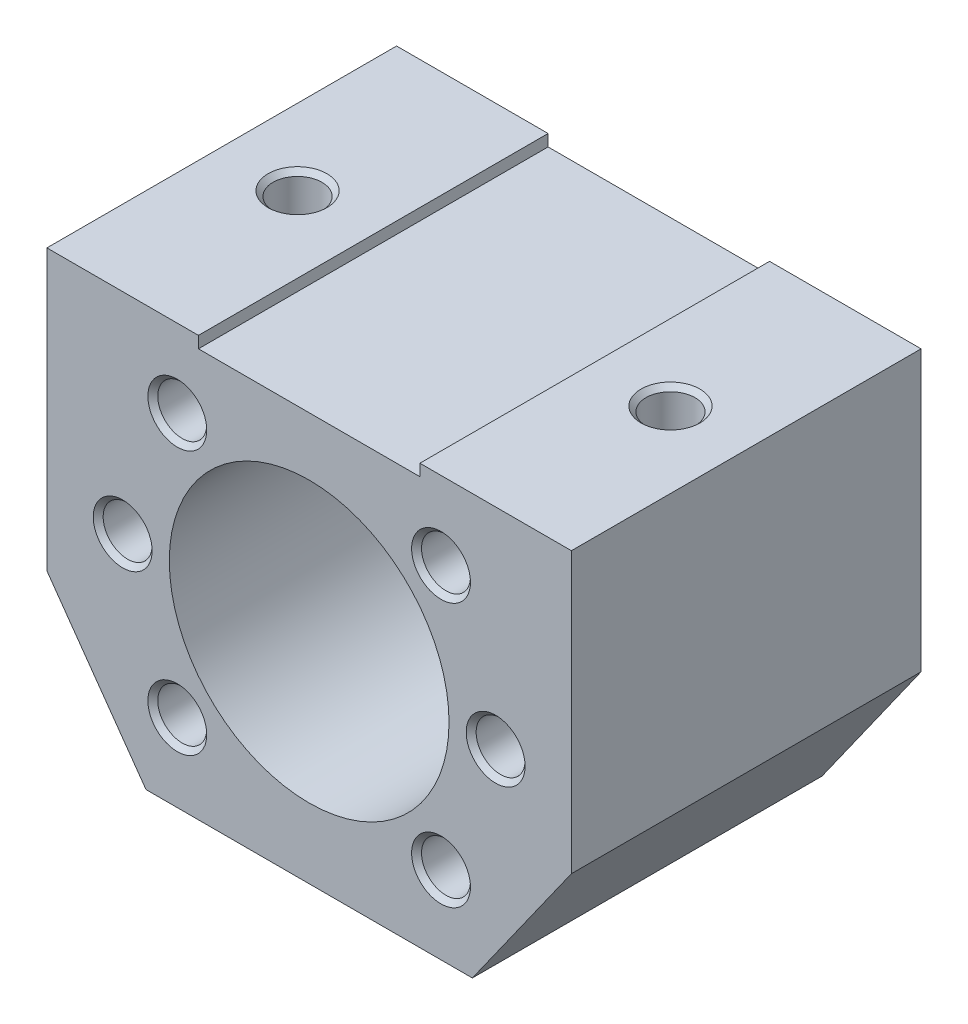
ISO-10303-21;
HEADER;
FILE_DESCRIPTION(('STEP AP214'),'2;1');
FILE_NAME('part.step','',(''),(''),'','','');
FILE_SCHEMA(('AUTOMOTIVE_DESIGN { 1 0 10303 214 1 1 1 1 }'));
ENDSEC;
DATA;
#1=APPLICATION_CONTEXT('core data for automotive mechanical design processes');
#2=APPLICATION_PROTOCOL_DEFINITION('international standard','automotive_design',2000,#1);
#3=PRODUCT_CONTEXT('',#1,'mechanical');
#4=PRODUCT('Part','Part','',(#3));
#5=PRODUCT_RELATED_PRODUCT_CATEGORY('part','',(#4));
#6=PRODUCT_DEFINITION_FORMATION('','',#4);
#7=PRODUCT_DEFINITION_CONTEXT('part definition',#1,'design');
#8=PRODUCT_DEFINITION('design','',#6,#7);
#9=PRODUCT_DEFINITION_SHAPE('','',#8);
#10=(LENGTH_UNIT() NAMED_UNIT(*) SI_UNIT(.MILLI.,.METRE.));
#11=(NAMED_UNIT(*) PLANE_ANGLE_UNIT() SI_UNIT($,.RADIAN.));
#12=(NAMED_UNIT(*) SI_UNIT($,.STERADIAN.) SOLID_ANGLE_UNIT());
#13=UNCERTAINTY_MEASURE_WITH_UNIT(LENGTH_MEASURE(1.E-05),#10,'distance_accuracy_value','');
#14=(GEOMETRIC_REPRESENTATION_CONTEXT(3) GLOBAL_UNCERTAINTY_ASSIGNED_CONTEXT((#13)) GLOBAL_UNIT_ASSIGNED_CONTEXT((#10,
#11,#12)) REPRESENTATION_CONTEXT('',''));
#15=CARTESIAN_POINT('',(0.,0.,0.));
#16=DIRECTION('',(0.,0.,1.));
#17=DIRECTION('',(1.,0.,0.));
#18=AXIS2_PLACEMENT_3D('',#15,#16,#17);
#19=CARTESIAN_POINT('',(-22.5,18.,-30.));
#20=DIRECTION('',(0.,1.,0.));
#21=DIRECTION('',(0.,0.,1.));
#22=AXIS2_PLACEMENT_3D('',#19,#20,#21);
#23=PLANE('',#22);
#24=CARTESIAN_POINT('',(-16.,18.,-15.));
#25=DIRECTION('',(0.,1.,0.));
#26=DIRECTION('',(0.,0.,1.));
#27=AXIS2_PLACEMENT_3D('',#24,#25,#26);
#28=CIRCLE('',#27,2.525);
#29=CARTESIAN_POINT('',(-16.,18.,-12.475));
#30=VERTEX_POINT('',#29);
#31=EDGE_CURVE('E382',#30,#30,#28,.T.);
#32=ORIENTED_EDGE('',*,*,#31,.F.);
#33=EDGE_LOOP('',(#32));
#34=FACE_BOUND('',#33,.T.);
#35=DIRECTION('',(0.,0.,1.));
#36=VECTOR('',#35,1.);
#37=CARTESIAN_POINT('',(-9.5,18.,-30.));
#38=LINE('',#37,#36);
#39=CARTESIAN_POINT('',(-9.5,18.,-30.));
#40=VERTEX_POINT('',#39);
#41=CARTESIAN_POINT('',(-9.5,18.,0.));
#42=VERTEX_POINT('',#41);
#43=EDGE_CURVE('E181',#40,#42,#38,.T.);
#44=ORIENTED_EDGE('',*,*,#43,.F.);
#45=DIRECTION('',(-1.,0.,0.));
#46=VECTOR('',#45,1.);
#47=CARTESIAN_POINT('',(0.,18.,-30.));
#48=LINE('',#47,#46);
#49=CARTESIAN_POINT('',(-22.5,18.,-30.));
#50=VERTEX_POINT('',#49);
#51=EDGE_CURVE('E70',#40,#50,#48,.T.);
#52=ORIENTED_EDGE('',*,*,#51,.T.);
#53=DIRECTION('',(0.,0.,1.));
#54=VECTOR('',#53,1.);
#55=CARTESIAN_POINT('',(-22.5,18.,-30.));
#56=LINE('',#55,#54);
#57=CARTESIAN_POINT('',(-22.5,18.,0.));
#58=VERTEX_POINT('',#57);
#59=EDGE_CURVE('E11',#50,#58,#56,.T.);
#60=ORIENTED_EDGE('',*,*,#59,.T.);
#61=DIRECTION('',(-1.,0.,0.));
#62=VECTOR('',#61,1.);
#63=CARTESIAN_POINT('',(-22.5,18.,0.));
#64=LINE('',#63,#62);
#65=EDGE_CURVE('E99',#42,#58,#64,.T.);
#66=ORIENTED_EDGE('',*,*,#65,.F.);
#67=EDGE_LOOP('',(#44,#52,#60,#66));
#68=FACE_BOUND('',#67,.T.);
#69=ADVANCED_FACE('F40',(#34,#68),#23,.T.);
#70=CARTESIAN_POINT('',(0.,0.,0.));
#71=DIRECTION('',(0.,0.,-1.));
#72=DIRECTION('',(-1.,0.,0.));
#73=AXIS2_PLACEMENT_3D('',#70,#71,#72);
#74=PLANE('',#73);
#75=CARTESIAN_POINT('',(16.,0.,0.));
#76=DIRECTION('',(0.,0.,1.));
#77=DIRECTION('',(1.,0.,0.));
#78=AXIS2_PLACEMENT_3D('',#75,#76,#77);
#79=CIRCLE('',#78,2.525);
#80=CARTESIAN_POINT('',(18.525,0.,0.));
#81=VERTEX_POINT('',#80);
#82=EDGE_CURVE('E339',#81,#81,#79,.T.);
#83=ORIENTED_EDGE('',*,*,#82,.F.);
#84=EDGE_LOOP('',(#83));
#85=FACE_BOUND('',#84,.T.);
#86=CARTESIAN_POINT('',(11.3137084989848,-11.3137084989847,0.));
#87=DIRECTION('',(0.,0.,1.));
#88=DIRECTION('',(1.,0.,0.));
#89=AXIS2_PLACEMENT_3D('',#86,#87,#88);
#90=CIRCLE('',#89,2.525);
#91=CARTESIAN_POINT('',(13.8387084989848,-11.3137084989847,0.));
#92=VERTEX_POINT('',#91);
#93=EDGE_CURVE('E330',#92,#92,#90,.T.);
#94=ORIENTED_EDGE('',*,*,#93,.F.);
#95=EDGE_LOOP('',(#94));
#96=FACE_BOUND('',#95,.T.);
#97=CARTESIAN_POINT('',(-11.3137084989847,-11.3137084989848,0.));
#98=DIRECTION('',(0.,0.,1.));
#99=DIRECTION('',(1.,0.,0.));
#100=AXIS2_PLACEMENT_3D('',#97,#98,#99);
#101=CIRCLE('',#100,2.525);
#102=CARTESIAN_POINT('',(-8.78870849898474,-11.3137084989848,0.));
#103=VERTEX_POINT('',#102);
#104=EDGE_CURVE('E321',#103,#103,#101,.T.);
#105=ORIENTED_EDGE('',*,*,#104,.F.);
#106=EDGE_LOOP('',(#105));
#107=FACE_BOUND('',#106,.T.);
#108=CARTESIAN_POINT('',(-16.,0.,0.));
#109=DIRECTION('',(0.,0.,1.));
#110=DIRECTION('',(1.,0.,0.));
#111=AXIS2_PLACEMENT_3D('',#108,#109,#110);
#112=CIRCLE('',#111,2.525);
#113=CARTESIAN_POINT('',(-13.475,0.,0.));
#114=VERTEX_POINT('',#113);
#115=EDGE_CURVE('E312',#114,#114,#112,.T.);
#116=ORIENTED_EDGE('',*,*,#115,.F.);
#117=EDGE_LOOP('',(#116));
#118=FACE_BOUND('',#117,.T.);
#119=CARTESIAN_POINT('',(0.,0.,0.));
#120=DIRECTION('',(0.,0.,1.));
#121=DIRECTION('',(1.,0.,0.));
#122=AXIS2_PLACEMENT_3D('',#119,#120,#121);
#123=CIRCLE('',#122,12.);
#124=CARTESIAN_POINT('',(12.,0.,0.));
#125=VERTEX_POINT('',#124);
#126=EDGE_CURVE('E301',#125,#125,#123,.T.);
#127=ORIENTED_EDGE('',*,*,#126,.F.);
#128=EDGE_LOOP('',(#127));
#129=FACE_BOUND('',#128,.T.);
#130=DIRECTION('',(1.,0.,0.));
#131=VECTOR('',#130,1.);
#132=CARTESIAN_POINT('',(-9.5,17.,0.));
#133=LINE('',#132,#131);
#134=CARTESIAN_POINT('',(-9.5,17.,0.));
#135=VERTEX_POINT('',#134);
#136=CARTESIAN_POINT('',(9.50000000000001,17.,0.));
#137=VERTEX_POINT('',#136);
#138=EDGE_CURVE('E373',#135,#137,#133,.T.);
#139=ORIENTED_EDGE('',*,*,#138,.F.);
#140=DIRECTION('',(0.,1.,0.));
#141=VECTOR('',#140,1.);
#142=CARTESIAN_POINT('',(-9.5,17.,0.));
#143=LINE('',#142,#141);
#144=EDGE_CURVE('E361',#135,#42,#143,.T.);
#145=ORIENTED_EDGE('',*,*,#144,.T.);
#146=ORIENTED_EDGE('',*,*,#65,.T.);
#147=DIRECTION('',(0.,-1.,0.));
#148=VECTOR('',#147,1.);
#149=CARTESIAN_POINT('',(-22.5,-6.,0.));
#150=LINE('',#149,#148);
#151=CARTESIAN_POINT('',(-22.5,-6.,0.));
#152=VERTEX_POINT('',#151);
#153=EDGE_CURVE('E154',#58,#152,#150,.T.);
#154=ORIENTED_EDGE('',*,*,#153,.T.);
#155=DIRECTION('',(0.578017340780339,-0.816024481101655,0.));
#156=VECTOR('',#155,1.);
#157=CARTESIAN_POINT('',(-14.,-18.,0.));
#158=LINE('',#157,#156);
#159=CARTESIAN_POINT('',(-14.,-18.,0.));
#160=VERTEX_POINT('',#159);
#161=EDGE_CURVE('E156',#152,#160,#158,.T.);
#162=ORIENTED_EDGE('',*,*,#161,.T.);
#163=DIRECTION('',(1.,0.,0.));
#164=VECTOR('',#163,1.);
#165=CARTESIAN_POINT('',(14.,-18.,0.));
#166=LINE('',#165,#164);
#167=CARTESIAN_POINT('',(14.,-18.,0.));
#168=VERTEX_POINT('',#167);
#169=EDGE_CURVE('E160',#160,#168,#166,.T.);
#170=ORIENTED_EDGE('',*,*,#169,.T.);
#171=DIRECTION('',(0.578017340780339,0.816024481101655,0.));
#172=VECTOR('',#171,1.);
#173=CARTESIAN_POINT('',(22.5,-6.,0.));
#174=LINE('',#173,#172);
#175=CARTESIAN_POINT('',(22.5,-6.,0.));
#176=VERTEX_POINT('',#175);
#177=EDGE_CURVE('E163',#168,#176,#174,.T.);
#178=ORIENTED_EDGE('',*,*,#177,.T.);
#179=DIRECTION('',(0.,1.,0.));
#180=VECTOR('',#179,1.);
#181=CARTESIAN_POINT('',(22.5,18.,0.));
#182=LINE('',#181,#180);
#183=CARTESIAN_POINT('',(22.5,18.,0.));
#184=VERTEX_POINT('',#183);
#185=EDGE_CURVE('E126',#176,#184,#182,.T.);
#186=ORIENTED_EDGE('',*,*,#185,.T.);
#187=CARTESIAN_POINT('',(9.50000000000001,18.,0.));
#188=VERTEX_POINT('',#187);
#189=EDGE_CURVE('E166',#184,#188,#64,.T.);
#190=ORIENTED_EDGE('',*,*,#189,.T.);
#191=DIRECTION('',(0.,1.,0.));
#192=VECTOR('',#191,1.);
#193=CARTESIAN_POINT('',(9.50000000000001,17.,0.));
#194=LINE('',#193,#192);
#195=EDGE_CURVE('E292',#137,#188,#194,.T.);
#196=ORIENTED_EDGE('',*,*,#195,.F.);
#197=EDGE_LOOP('',(#139,#145,#146,#154,#162,#170,#178,#186,#190,#196));
#198=FACE_BOUND('',#197,.T.);
#199=CARTESIAN_POINT('',(11.3137084989847,11.3137084989849,0.));
#200=DIRECTION('',(0.,0.,1.));
#201=DIRECTION('',(1.,0.,0.));
#202=AXIS2_PLACEMENT_3D('',#199,#200,#201);
#203=CIRCLE('',#202,2.525);
#204=CARTESIAN_POINT('',(13.8387084989847,11.3137084989849,0.));
#205=VERTEX_POINT('',#204);
#206=EDGE_CURVE('E348',#205,#205,#203,.T.);
#207=ORIENTED_EDGE('',*,*,#206,.F.);
#208=EDGE_LOOP('',(#207));
#209=FACE_BOUND('',#208,.T.);
#210=CARTESIAN_POINT('',(-11.3137084989849,11.3137084989846,0.));
#211=DIRECTION('',(0.,0.,1.));
#212=DIRECTION('',(1.,0.,0.));
#213=AXIS2_PLACEMENT_3D('',#210,#211,#212);
#214=CIRCLE('',#213,2.525);
#215=CARTESIAN_POINT('',(-8.7887084989849,11.3137084989846,0.));
#216=VERTEX_POINT('',#215);
#217=EDGE_CURVE('E357',#216,#216,#214,.T.);
#218=ORIENTED_EDGE('',*,*,#217,.F.);
#219=EDGE_LOOP('',(#218));
#220=FACE_BOUND('',#219,.T.);
#221=ADVANCED_FACE('F256',(#85,#96,#107,#118,#129,#198,#209,#220),#74,.F.);
#222=CARTESIAN_POINT('',(-22.5,-6.,-30.));
#223=DIRECTION('',(-1.,0.,0.));
#224=DIRECTION('',(0.,-1.,0.));
#225=AXIS2_PLACEMENT_3D('',#222,#223,#224);
#226=PLANE('',#225);
#227=ORIENTED_EDGE('',*,*,#153,.F.);
#228=ORIENTED_EDGE('',*,*,#59,.F.);
#229=DIRECTION('',(0.,-1.,0.));
#230=VECTOR('',#229,1.);
#231=CARTESIAN_POINT('',(-22.5,-6.,-30.));
#232=LINE('',#231,#230);
#233=CARTESIAN_POINT('',(-22.5,-6.,-30.));
#234=VERTEX_POINT('',#233);
#235=EDGE_CURVE('E168',#50,#234,#232,.T.);
#236=ORIENTED_EDGE('',*,*,#235,.T.);
#237=DIRECTION('',(0.,0.,1.));
#238=VECTOR('',#237,1.);
#239=CARTESIAN_POINT('',(-22.5,-6.,-30.));
#240=LINE('',#239,#238);
#241=EDGE_CURVE('E106',#234,#152,#240,.T.);
#242=ORIENTED_EDGE('',*,*,#241,.T.);
#243=EDGE_LOOP('',(#227,#228,#236,#242));
#244=FACE_BOUND('',#243,.T.);
#245=ADVANCED_FACE('F42',(#244),#226,.T.);
#246=CARTESIAN_POINT('',(16.,18.,-15.));
#247=DIRECTION('',(0.,1.,0.));
#248=DIRECTION('',(0.,0.,1.));
#249=AXIS2_PLACEMENT_3D('',#246,#247,#248);
#250=CIRCLE('',#249,2.525);
#251=CARTESIAN_POINT('',(16.,18.,-12.475));
#252=VERTEX_POINT('',#251);
#253=EDGE_CURVE('E277',#252,#252,#250,.T.);
#254=ORIENTED_EDGE('',*,*,#253,.F.);
#255=EDGE_LOOP('',(#254));
#256=FACE_BOUND('',#255,.T.);
#257=DIRECTION('',(0.,0.,-1.));
#258=VECTOR('',#257,1.);
#259=CARTESIAN_POINT('',(9.5,18.,-30.));
#260=LINE('',#259,#258);
#261=CARTESIAN_POINT('',(9.5,18.,-30.));
#262=VERTEX_POINT('',#261);
#263=EDGE_CURVE('E281',#188,#262,#260,.T.);
#264=ORIENTED_EDGE('',*,*,#263,.F.);
#265=ORIENTED_EDGE('',*,*,#189,.F.);
#266=DIRECTION('',(0.,0.,1.));
#267=VECTOR('',#266,1.);
#268=CARTESIAN_POINT('',(22.5,18.,-30.));
#269=LINE('',#268,#267);
#270=CARTESIAN_POINT('',(22.5,18.,-30.));
#271=VERTEX_POINT('',#270);
#272=EDGE_CURVE('E54',#271,#184,#269,.T.);
#273=ORIENTED_EDGE('',*,*,#272,.F.);
#274=EDGE_CURVE('E144',#271,#262,#48,.T.);
#275=ORIENTED_EDGE('',*,*,#274,.T.);
#276=EDGE_LOOP('',(#264,#265,#273,#275));
#277=FACE_BOUND('',#276,.T.);
#278=ADVANCED_FACE('F259',(#256,#277),#23,.T.);
#279=CARTESIAN_POINT('',(22.5,18.,-30.));
#280=DIRECTION('',(1.,0.,0.));
#281=DIRECTION('',(0.,1.,0.));
#282=AXIS2_PLACEMENT_3D('',#279,#280,#281);
#283=PLANE('',#282);
#284=ORIENTED_EDGE('',*,*,#185,.F.);
#285=DIRECTION('',(0.,0.,1.));
#286=VECTOR('',#285,1.);
#287=CARTESIAN_POINT('',(22.5,-6.,-30.));
#288=LINE('',#287,#286);
#289=CARTESIAN_POINT('',(22.5,-6.,-30.));
#290=VERTEX_POINT('',#289);
#291=EDGE_CURVE('E120',#290,#176,#288,.T.);
#292=ORIENTED_EDGE('',*,*,#291,.F.);
#293=DIRECTION('',(0.,1.,0.));
#294=VECTOR('',#293,1.);
#295=CARTESIAN_POINT('',(22.5,18.,-30.));
#296=LINE('',#295,#294);
#297=EDGE_CURVE('E124',#290,#271,#296,.T.);
#298=ORIENTED_EDGE('',*,*,#297,.T.);
#299=ORIENTED_EDGE('',*,*,#272,.T.);
#300=EDGE_LOOP('',(#284,#292,#298,#299));
#301=FACE_BOUND('',#300,.T.);
#302=ADVANCED_FACE('F122',(#301),#283,.T.);
#303=CARTESIAN_POINT('',(22.5,-6.,-30.));
#304=DIRECTION('',(0.816024481101655,-0.578017340780339,0.));
#305=DIRECTION('',(0.578017340780339,0.816024481101655,0.));
#306=AXIS2_PLACEMENT_3D('',#303,#304,#305);
#307=PLANE('',#306);
#308=ORIENTED_EDGE('',*,*,#177,.F.);
#309=DIRECTION('',(0.,0.,1.));
#310=VECTOR('',#309,1.);
#311=CARTESIAN_POINT('',(14.,-18.,-30.));
#312=LINE('',#311,#310);
#313=CARTESIAN_POINT('',(14.,-18.,-30.));
#314=VERTEX_POINT('',#313);
#315=EDGE_CURVE('E131',#314,#168,#312,.T.);
#316=ORIENTED_EDGE('',*,*,#315,.F.);
#317=DIRECTION('',(0.578017340780339,0.816024481101655,0.));
#318=VECTOR('',#317,1.);
#319=CARTESIAN_POINT('',(22.5,-6.,-30.));
#320=LINE('',#319,#318);
#321=EDGE_CURVE('E140',#314,#290,#320,.T.);
#322=ORIENTED_EDGE('',*,*,#321,.T.);
#323=ORIENTED_EDGE('',*,*,#291,.T.);
#324=EDGE_LOOP('',(#308,#316,#322,#323));
#325=FACE_BOUND('',#324,.T.);
#326=ADVANCED_FACE('F146',(#325),#307,.T.);
#327=CARTESIAN_POINT('',(14.,-18.,-30.));
#328=DIRECTION('',(0.,-1.,0.));
#329=DIRECTION('',(1.,0.,0.));
#330=AXIS2_PLACEMENT_3D('',#327,#328,#329);
#331=PLANE('',#330);
#332=ORIENTED_EDGE('',*,*,#169,.F.);
#333=DIRECTION('',(0.,0.,1.));
#334=VECTOR('',#333,1.);
#335=CARTESIAN_POINT('',(-14.,-18.,-30.));
#336=LINE('',#335,#334);
#337=CARTESIAN_POINT('',(-14.,-18.,-30.));
#338=VERTEX_POINT('',#337);
#339=EDGE_CURVE('E172',#338,#160,#336,.T.);
#340=ORIENTED_EDGE('',*,*,#339,.F.);
#341=DIRECTION('',(1.,0.,0.));
#342=VECTOR('',#341,1.);
#343=CARTESIAN_POINT('',(14.,-18.,-30.));
#344=LINE('',#343,#342);
#345=EDGE_CURVE('E147',#338,#314,#344,.T.);
#346=ORIENTED_EDGE('',*,*,#345,.T.);
#347=ORIENTED_EDGE('',*,*,#315,.T.);
#348=EDGE_LOOP('',(#332,#340,#346,#347));
#349=FACE_BOUND('',#348,.T.);
#350=ADVANCED_FACE('F295',(#349),#331,.T.);
#351=CARTESIAN_POINT('',(-14.,-18.,-30.));
#352=DIRECTION('',(-0.816024481101655,-0.578017340780339,0.));
#353=DIRECTION('',(0.578017340780339,-0.816024481101655,0.));
#354=AXIS2_PLACEMENT_3D('',#351,#352,#353);
#355=PLANE('',#354);
#356=ORIENTED_EDGE('',*,*,#161,.F.);
#357=ORIENTED_EDGE('',*,*,#241,.F.);
#358=DIRECTION('',(0.578017340780339,-0.816024481101655,0.));
#359=VECTOR('',#358,1.);
#360=CARTESIAN_POINT('',(-14.,-18.,-30.));
#361=LINE('',#360,#359);
#362=EDGE_CURVE('E149',#234,#338,#361,.T.);
#363=ORIENTED_EDGE('',*,*,#362,.T.);
#364=ORIENTED_EDGE('',*,*,#339,.T.);
#365=EDGE_LOOP('',(#356,#357,#363,#364));
#366=FACE_BOUND('',#365,.T.);
#367=ADVANCED_FACE('F298',(#366),#355,.T.);
#368=CARTESIAN_POINT('',(0.,0.,-30.));
#369=DIRECTION('',(0.,0.,-1.));
#370=DIRECTION('',(-1.,0.,0.));
#371=AXIS2_PLACEMENT_3D('',#368,#369,#370);
#372=PLANE('',#371);
#373=DIRECTION('',(0.,1.,0.));
#374=VECTOR('',#373,1.);
#375=CARTESIAN_POINT('',(-9.5,17.,-30.));
#376=LINE('',#375,#374);
#377=CARTESIAN_POINT('',(-9.5,17.,-30.));
#378=VERTEX_POINT('',#377);
#379=EDGE_CURVE('E360',#378,#40,#376,.T.);
#380=ORIENTED_EDGE('',*,*,#379,.F.);
#381=DIRECTION('',(-1.,0.,0.));
#382=VECTOR('',#381,1.);
#383=CARTESIAN_POINT('',(-9.5,17.,-30.));
#384=LINE('',#383,#382);
#385=CARTESIAN_POINT('',(9.50000000000001,17.,-30.));
#386=VERTEX_POINT('',#385);
#387=EDGE_CURVE('E363',#386,#378,#384,.T.);
#388=ORIENTED_EDGE('',*,*,#387,.F.);
#389=DIRECTION('',(0.,1.,0.));
#390=VECTOR('',#389,1.);
#391=CARTESIAN_POINT('',(9.5,17.,-30.));
#392=LINE('',#391,#390);
#393=EDGE_CURVE('E365',#386,#262,#392,.T.);
#394=ORIENTED_EDGE('',*,*,#393,.T.);
#395=ORIENTED_EDGE('',*,*,#274,.F.);
#396=ORIENTED_EDGE('',*,*,#297,.F.);
#397=ORIENTED_EDGE('',*,*,#321,.F.);
#398=ORIENTED_EDGE('',*,*,#345,.F.);
#399=ORIENTED_EDGE('',*,*,#362,.F.);
#400=ORIENTED_EDGE('',*,*,#235,.F.);
#401=ORIENTED_EDGE('',*,*,#51,.F.);
#402=EDGE_LOOP('',(#380,#388,#394,#395,#396,#397,#398,#399,#400,#401));
#403=FACE_BOUND('',#402,.T.);
#404=CARTESIAN_POINT('',(-11.3137084989849,11.3137084989846,-30.));
#405=DIRECTION('',(0.,0.,1.));
#406=DIRECTION('',(1.,0.,0.));
#407=AXIS2_PLACEMENT_3D('',#404,#405,#406);
#408=CIRCLE('',#407,2.09999999999999);
#409=CARTESIAN_POINT('',(-9.21370849898491,11.3137084989846,-30.));
#410=VERTEX_POINT('',#409);
#411=EDGE_CURVE('E351',#410,#410,#408,.T.);
#412=ORIENTED_EDGE('',*,*,#411,.T.);
#413=EDGE_LOOP('',(#412));
#414=FACE_BOUND('',#413,.T.);
#415=CARTESIAN_POINT('',(11.3137084989847,11.3137084989849,-30.));
#416=DIRECTION('',(0.,0.,1.));
#417=DIRECTION('',(1.,0.,0.));
#418=AXIS2_PLACEMENT_3D('',#415,#416,#417);
#419=CIRCLE('',#418,2.09999999999999);
#420=CARTESIAN_POINT('',(13.4137084989847,11.3137084989849,-30.));
#421=VERTEX_POINT('',#420);
#422=EDGE_CURVE('E342',#421,#421,#419,.T.);
#423=ORIENTED_EDGE('',*,*,#422,.T.);
#424=EDGE_LOOP('',(#423));
#425=FACE_BOUND('',#424,.T.);
#426=CARTESIAN_POINT('',(16.,0.,-30.));
#427=DIRECTION('',(0.,0.,1.));
#428=DIRECTION('',(1.,0.,0.));
#429=AXIS2_PLACEMENT_3D('',#426,#427,#428);
#430=CIRCLE('',#429,2.09999999999999);
#431=CARTESIAN_POINT('',(18.1,0.,-30.));
#432=VERTEX_POINT('',#431);
#433=EDGE_CURVE('E333',#432,#432,#430,.T.);
#434=ORIENTED_EDGE('',*,*,#433,.T.);
#435=EDGE_LOOP('',(#434));
#436=FACE_BOUND('',#435,.T.);
#437=CARTESIAN_POINT('',(11.3137084989848,-11.3137084989847,-30.));
#438=DIRECTION('',(0.,0.,1.));
#439=DIRECTION('',(1.,0.,0.));
#440=AXIS2_PLACEMENT_3D('',#437,#438,#439);
#441=CIRCLE('',#440,2.09999999999999);
#442=CARTESIAN_POINT('',(13.4137084989848,-11.3137084989847,-30.));
#443=VERTEX_POINT('',#442);
#444=EDGE_CURVE('E324',#443,#443,#441,.T.);
#445=ORIENTED_EDGE('',*,*,#444,.T.);
#446=EDGE_LOOP('',(#445));
#447=FACE_BOUND('',#446,.T.);
#448=CARTESIAN_POINT('',(-11.3137084989847,-11.3137084989848,-30.));
#449=DIRECTION('',(0.,0.,1.));
#450=DIRECTION('',(1.,0.,0.));
#451=AXIS2_PLACEMENT_3D('',#448,#449,#450);
#452=CIRCLE('',#451,2.09999999999999);
#453=CARTESIAN_POINT('',(-9.21370849898475,-11.3137084989848,-30.));
#454=VERTEX_POINT('',#453);
#455=EDGE_CURVE('E315',#454,#454,#452,.T.);
#456=ORIENTED_EDGE('',*,*,#455,.T.);
#457=EDGE_LOOP('',(#456));
#458=FACE_BOUND('',#457,.T.);
#459=CARTESIAN_POINT('',(-16.,0.,-30.));
#460=DIRECTION('',(0.,0.,1.));
#461=DIRECTION('',(1.,0.,0.));
#462=AXIS2_PLACEMENT_3D('',#459,#460,#461);
#463=CIRCLE('',#462,2.09999999999999);
#464=CARTESIAN_POINT('',(-13.9,0.,-30.));
#465=VERTEX_POINT('',#464);
#466=EDGE_CURVE('E304',#465,#465,#463,.T.);
#467=ORIENTED_EDGE('',*,*,#466,.T.);
#468=EDGE_LOOP('',(#467));
#469=FACE_BOUND('',#468,.T.);
#470=CARTESIAN_POINT('',(0.,0.,-30.));
#471=DIRECTION('',(0.,0.,1.));
#472=DIRECTION('',(1.,0.,0.));
#473=AXIS2_PLACEMENT_3D('',#470,#471,#472);
#474=CIRCLE('',#473,12.);
#475=CARTESIAN_POINT('',(12.,0.,-30.));
#476=VERTEX_POINT('',#475);
#477=EDGE_CURVE('E157',#476,#476,#474,.T.);
#478=ORIENTED_EDGE('',*,*,#477,.T.);
#479=EDGE_LOOP('',(#478));
#480=FACE_BOUND('',#479,.T.);
#481=ADVANCED_FACE('F137',(#403,#414,#425,#436,#447,#458,#469,#480),#372,.T.);
#482=CARTESIAN_POINT('',(0.,0.,-30.));
#483=DIRECTION('',(0.,0.,1.));
#484=DIRECTION('',(1.,0.,0.));
#485=AXIS2_PLACEMENT_3D('',#482,#483,#484);
#486=CYLINDRICAL_SURFACE('',#485,12.);
#487=ORIENTED_EDGE('',*,*,#477,.F.);
#488=EDGE_LOOP('',(#487));
#489=FACE_BOUND('',#488,.T.);
#490=ORIENTED_EDGE('',*,*,#126,.T.);
#491=EDGE_LOOP('',(#490));
#492=FACE_BOUND('',#491,.T.);
#493=ADVANCED_FACE('F251',(#489,#492),#486,.F.);
#494=CARTESIAN_POINT('',(-16.,0.,0.));
#495=DIRECTION('',(0.,0.,1.));
#496=DIRECTION('',(1.,0.,0.));
#497=AXIS2_PLACEMENT_3D('',#494,#495,#496);
#498=CYLINDRICAL_SURFACE('',#497,2.1);
#499=CARTESIAN_POINT('',(-16.4758754875379,2.04537100124183,-15.1868132322646));
#500=CARTESIAN_POINT('',(-16.4860625546296,2.0430018425825,-15.1500639175025));
#501=CARTESIAN_POINT('',(-16.4932034993981,2.04126628807666,-15.1123655144882));
#502=CARTESIAN_POINT('',(-16.5012815219468,2.03929734344209,-15.0362040719698));
#503=CARTESIAN_POINT('',(-16.5022016972571,2.03906804601643,-14.997739233793));
#504=CARTESIAN_POINT('',(-16.4977925865183,2.04014896619577,-14.9211265609456));
#505=CARTESIAN_POINT('',(-16.4924544349038,2.04146136778168,-14.8829792532632));
#506=CARTESIAN_POINT('',(-16.4755691357259,2.04546050198665,-14.8081577950043));
#507=CARTESIAN_POINT('',(-16.4640226195572,2.04814709484821,-14.7714834950295));
#508=CARTESIAN_POINT('',(-16.4349092195522,2.05452539486397,-14.7009316370894));
#509=CARTESIAN_POINT('',(-16.4173764244639,2.0582113870072,-14.6670395625903));
#510=CARTESIAN_POINT('',(-16.376403899249,2.06609616734942,-14.6031012191034));
#511=CARTESIAN_POINT('',(-16.3529724888447,2.07029422903493,-14.5730496225616));
#512=CARTESIAN_POINT('',(-16.307600589187,2.07743962907381,-14.5257680503339));
#513=CARTESIAN_POINT('',(-16.2869802679022,2.08041729431618,-14.5072714824623));
#514=CARTESIAN_POINT('',(-16.2429520552429,2.08601664080553,-14.4738705728731));
#515=CARTESIAN_POINT('',(-16.2195460195933,2.08863855657366,-14.4589638595389));
#516=CARTESIAN_POINT('',(-16.1701497871015,2.09324345975333,-14.4334485413072));
#517=CARTESIAN_POINT('',(-16.1441389352703,2.0952207075162,-14.4228783418595));
#518=CARTESIAN_POINT('',(-16.0904983212202,2.09822004796124,-14.4070351576763));
#519=CARTESIAN_POINT('',(-16.0628705011937,2.09924326251855,-14.4017559505617));
#520=CARTESIAN_POINT('',(-16.0111453729978,2.10010635404501,-14.3973015950382));
#521=CARTESIAN_POINT('',(-15.9871148839242,2.10009587869797,-14.397354536201));
#522=CARTESIAN_POINT('',(-15.9394516549021,2.09926211116382,-14.4016599419317));
#523=CARTESIAN_POINT('',(-15.9158188526,2.09843894762969,-14.4059117417973));
#524=CARTESIAN_POINT('',(-15.8708491860897,2.09613978335578,-14.4180049888482));
#525=CARTESIAN_POINT('',(-15.849456762118,2.0946995920212,-14.4256502647665));
#526=CARTESIAN_POINT('',(-15.8081092709594,2.09131748613532,-14.4440577053913));
#527=CARTESIAN_POINT('',(-15.7881545466398,2.08937545240625,-14.4548206105476));
#528=CARTESIAN_POINT('',(-15.7480502539605,2.08493860920674,-14.4802410359988));
#529=CARTESIAN_POINT('',(-15.7280856129655,2.08240773641513,-14.4951825888134));
#530=CARTESIAN_POINT('',(-15.690493376779,2.07715349159937,-14.5277256003047));
#531=CARTESIAN_POINT('',(-15.6728671064233,2.07443001177925,-14.545328554854));
#532=CARTESIAN_POINT('',(-15.6371381256109,2.068505690362,-14.5860343921507));
#533=CARTESIAN_POINT('',(-15.6195143348213,2.06530661618935,-14.6095578227394));
#534=CARTESIAN_POINT('',(-15.5877847915534,2.05920854626218,-14.6589011469737));
#535=CARTESIAN_POINT('',(-15.5736812801341,2.05630974234727,-14.684722489387));
#536=CARTESIAN_POINT('',(-15.5469658406437,2.05060436168535,-14.7426062623998));
#537=CARTESIAN_POINT('',(-15.5350132547729,2.04789692727097,-14.7749841736736));
#538=CARTESIAN_POINT('',(-15.5160940300915,2.04350901873177,-14.8412318669851));
#539=CARTESIAN_POINT('',(-15.5091294628234,2.04182897132685,-14.8751022626656));
#540=CARTESIAN_POINT('',(-15.4998367678322,2.03957428193417,-14.9467195884947));
#541=CARTESIAN_POINT('',(-15.4979984401217,2.03911658485903,-14.9845347529991));
#542=CARTESIAN_POINT('',(-15.5003755976035,2.03970008614358,-15.0599654993046));
#543=CARTESIAN_POINT('',(-15.504592148973,2.04074154848377,-15.0975810447849));
#544=CARTESIAN_POINT('',(-15.5191810144526,2.04422860943211,-15.1723398137671));
#545=CARTESIAN_POINT('',(-15.5296773263229,2.04670245881869,-15.2094576890974));
#546=CARTESIAN_POINT('',(-15.5568436557823,2.05275556465456,-15.28131375382));
#547=CARTESIAN_POINT('',(-15.5735180359123,2.05633560192283,-15.316050241045));
#548=CARTESIAN_POINT('',(-15.6123152683549,2.06399605391517,-15.3808634544886));
#549=CARTESIAN_POINT('',(-15.6342586743219,2.06805812597987,-15.4110491032171));
#550=CARTESIAN_POINT('',(-15.6836269796553,2.07618125444869,-15.4665286336253));
#551=CARTESIAN_POINT('',(-15.7110380735133,2.08024228812592,-15.4918345260687));
#552=CARTESIAN_POINT('',(-15.7612225723905,2.08648118621927,-15.5287702826789));
#553=CARTESIAN_POINT('',(-15.7826672474799,2.08884548744872,-15.5421839974999));
#554=CARTESIAN_POINT('',(-15.8275104397118,2.09302473620044,-15.5653382548843));
#555=CARTESIAN_POINT('',(-15.8509071934142,2.09484017283649,-15.5750820697477));
#556=CARTESIAN_POINT('',(-15.8992580724813,2.09772260121575,-15.5903595921678));
#557=CARTESIAN_POINT('',(-15.9242209349754,2.09878489449453,-15.5958668881167));
#558=CARTESIAN_POINT('',(-15.9747582863802,2.10000002545817,-15.602156172971));
#559=CARTESIAN_POINT('',(-16.0003325011034,2.10015326344063,-15.6029402417263));
#560=CARTESIAN_POINT('',(-16.0485835720793,2.09956261140014,-15.5998922631557));
#561=CARTESIAN_POINT('',(-16.0712921462554,2.0989077806147,-15.596518509546));
#562=CARTESIAN_POINT('',(-16.1158231515202,2.09692203784504,-15.5861271073116));
#563=CARTESIAN_POINT('',(-16.1376454832775,2.09559105030095,-15.5791090514377));
#564=CARTESIAN_POINT('',(-16.1802677452708,2.09235968278589,-15.5616644627483));
#565=CARTESIAN_POINT('',(-16.2010434061052,2.09044983577065,-15.551180973546));
#566=CARTESIAN_POINT('',(-16.2408090630346,2.08624340123188,-15.5273250350959));
#567=CARTESIAN_POINT('',(-16.2597985565054,2.08394670535418,-15.5139517761422));
#568=CARTESIAN_POINT('',(-16.2983532112116,2.07880159600282,-15.4827055205741));
#569=CARTESIAN_POINT('',(-16.3176135076513,2.0759212276616,-15.4644626893292));
#570=CARTESIAN_POINT('',(-16.3533746155945,2.07013411932518,-15.425439106934));
#571=CARTESIAN_POINT('',(-16.3698723451198,2.06722735364044,-15.4046555654303));
#572=CARTESIAN_POINT('',(-16.4028253807356,2.06108302783835,-15.3570236009772));
#573=CARTESIAN_POINT('',(-16.4186978219398,2.05788501520839,-15.329767282818));
#574=CARTESIAN_POINT('',(-16.4463122728975,2.05207332213061,-15.2732305630476));
#575=CARTESIAN_POINT('',(-16.4580608267785,2.04945871830565,-15.2439534573633));
#576=CARTESIAN_POINT('',(-16.4706285066913,2.04658665385252,-15.2050053658019));
#577=CARTESIAN_POINT('',(-16.4733459079506,2.04595929376308,-15.1959385590766));
#578=CARTESIAN_POINT('',(-16.4758754875379,2.04537100124183,-15.1868132322646));
#579=B_SPLINE_CURVE_WITH_KNOTS('',3,(#499,#500,#501,#502,#503,#504,#505,#506,#507,#508,#509,
#510,#511,#512,#513,#514,#515,#516,#517,#518,#519,#520,#521,#522,#523,#524,#525,#526,#527,#528,
#529,#530,#531,#532,#533,#534,#535,#536,#537,#538,#539,#540,#541,#542,#543,#544,#545,#546,#547,
#548,#549,#550,#551,#552,#553,#554,#555,#556,#557,#558,#559,#560,#561,#562,#563,#564,#565,#566,
#567,#568,#569,#570,#571,#572,#573,#574,#575,#576,#577,#578),.UNSPECIFIED.,.T.,.F.,(4,2,2,2,2,2,
2,2,2,2,2,2,2,2,2,2,2,2,2,2,2,2,2,2,2,2,2,2,2,2,2,2,2,2,2,2,2,2,2,4),(0.,0.11460031119038,
0.229511878495514,0.344586426776967,0.459649274115024,0.574067533940063,0.68832530758182,
0.771584778141088,0.854789091981948,0.938715158419458,1.02254240884577,1.09425469703685,
1.16595563460085,1.23396348264534,1.30198749609287,1.37690050106689,1.45185576940042,
1.54022082214862,1.6286419866637,1.73206915672764,1.83553925560874,1.94860371234198,
2.06168808054218,2.17708267643498,2.29255891209673,2.4045532257346,2.51626826210896,
2.59218351213073,2.6680309104627,2.744347413605,2.82063030869079,2.88920753142301,
2.95779241927861,3.02756577937195,3.09735871518705,3.1771157703489,3.25696121977307,
3.35171233272089,3.44631239964407,3.47476912867812),.UNSPECIFIED.);
#580=CARTESIAN_POINT('',(-16.4758754875379,2.04537100124183,-15.1868132322646));
#581=VERTEX_POINT('',#580);
#582=EDGE_CURVE('E174',#581,#581,#579,.T.);
#583=ORIENTED_EDGE('',*,*,#582,.T.);
#584=EDGE_LOOP('',(#583));
#585=FACE_BOUND('',#584,.T.);
#586=ORIENTED_EDGE('',*,*,#466,.F.);
#587=EDGE_LOOP('',(#586));
#588=FACE_BOUND('',#587,.T.);
#589=CARTESIAN_POINT('',(-16.,0.,-0.425000000000003));
#590=DIRECTION('',(0.,0.,1.));
#591=DIRECTION('',(1.,0.,0.));
#592=AXIS2_PLACEMENT_3D('',#589,#590,#591);
#593=CIRCLE('',#592,2.1);
#594=CARTESIAN_POINT('',(-13.9,0.,-0.425000000000003));
#595=VERTEX_POINT('',#594);
#596=EDGE_CURVE('E309',#595,#595,#593,.T.);
#597=ORIENTED_EDGE('',*,*,#596,.T.);
#598=EDGE_LOOP('',(#597));
#599=FACE_BOUND('',#598,.T.);
#600=ADVANCED_FACE('F183',(#585,#588,#599),#498,.F.);
#601=CARTESIAN_POINT('',(-16.,0.,0.));
#602=DIRECTION('',(0.,0.,1.));
#603=DIRECTION('',(1.,0.,0.));
#604=AXIS2_PLACEMENT_3D('',#601,#602,#603);
#605=CONICAL_SURFACE('',#604,2.525,0.785398163397444);
#606=ORIENTED_EDGE('',*,*,#596,.F.);
#607=EDGE_LOOP('',(#606));
#608=FACE_BOUND('',#607,.T.);
#609=ORIENTED_EDGE('',*,*,#115,.T.);
#610=EDGE_LOOP('',(#609));
#611=FACE_BOUND('',#610,.T.);
#612=ADVANCED_FACE('F244',(#608,#611),#605,.F.);
#613=CARTESIAN_POINT('',(-11.3137084989847,-11.3137084989848,0.));
#614=DIRECTION('',(0.,0.,1.));
#615=DIRECTION('',(1.,0.,0.));
#616=AXIS2_PLACEMENT_3D('',#613,#614,#615);
#617=CYLINDRICAL_SURFACE('',#616,2.1);
#618=ORIENTED_EDGE('',*,*,#455,.F.);
#619=EDGE_LOOP('',(#618));
#620=FACE_BOUND('',#619,.T.);
#621=CARTESIAN_POINT('',(-11.3137084989847,-11.3137084989848,-0.425000000000003));
#622=DIRECTION('',(0.,0.,1.));
#623=DIRECTION('',(1.,0.,0.));
#624=AXIS2_PLACEMENT_3D('',#621,#622,#623);
#625=CIRCLE('',#624,2.1);
#626=CARTESIAN_POINT('',(-9.21370849898474,-11.3137084989848,-0.425000000000003));
#627=VERTEX_POINT('',#626);
#628=EDGE_CURVE('E318',#627,#627,#625,.T.);
#629=ORIENTED_EDGE('',*,*,#628,.T.);
#630=EDGE_LOOP('',(#629));
#631=FACE_BOUND('',#630,.T.);
#632=ADVANCED_FACE('F241',(#620,#631),#617,.F.);
#633=CARTESIAN_POINT('',(-11.3137084989847,-11.3137084989848,0.));
#634=DIRECTION('',(0.,0.,1.));
#635=DIRECTION('',(1.,0.,0.));
#636=AXIS2_PLACEMENT_3D('',#633,#634,#635);
#637=CONICAL_SURFACE('',#636,2.525,0.785398163397444);
#638=ORIENTED_EDGE('',*,*,#628,.F.);
#639=EDGE_LOOP('',(#638));
#640=FACE_BOUND('',#639,.T.);
#641=ORIENTED_EDGE('',*,*,#104,.T.);
#642=EDGE_LOOP('',(#641));
#643=FACE_BOUND('',#642,.T.);
#644=ADVANCED_FACE('F237',(#640,#643),#637,.F.);
#645=CARTESIAN_POINT('',(11.3137084989848,-11.3137084989847,0.));
#646=DIRECTION('',(0.,0.,1.));
#647=DIRECTION('',(1.,0.,0.));
#648=AXIS2_PLACEMENT_3D('',#645,#646,#647);
#649=CYLINDRICAL_SURFACE('',#648,2.1);
#650=ORIENTED_EDGE('',*,*,#444,.F.);
#651=EDGE_LOOP('',(#650));
#652=FACE_BOUND('',#651,.T.);
#653=CARTESIAN_POINT('',(11.3137084989848,-11.3137084989847,-0.425000000000003));
#654=DIRECTION('',(0.,0.,1.));
#655=DIRECTION('',(1.,0.,0.));
#656=AXIS2_PLACEMENT_3D('',#653,#654,#655);
#657=CIRCLE('',#656,2.1);
#658=CARTESIAN_POINT('',(13.4137084989848,-11.3137084989847,-0.425000000000003));
#659=VERTEX_POINT('',#658);
#660=EDGE_CURVE('E327',#659,#659,#657,.T.);
#661=ORIENTED_EDGE('',*,*,#660,.T.);
#662=EDGE_LOOP('',(#661));
#663=FACE_BOUND('',#662,.T.);
#664=ADVANCED_FACE('F233',(#652,#663),#649,.F.);
#665=CARTESIAN_POINT('',(11.3137084989848,-11.3137084989847,0.));
#666=DIRECTION('',(0.,0.,1.));
#667=DIRECTION('',(1.,0.,0.));
#668=AXIS2_PLACEMENT_3D('',#665,#666,#667);
#669=CONICAL_SURFACE('',#668,2.525,0.785398163397442);
#670=ORIENTED_EDGE('',*,*,#660,.F.);
#671=EDGE_LOOP('',(#670));
#672=FACE_BOUND('',#671,.T.);
#673=ORIENTED_EDGE('',*,*,#93,.T.);
#674=EDGE_LOOP('',(#673));
#675=FACE_BOUND('',#674,.T.);
#676=ADVANCED_FACE('F229',(#672,#675),#669,.F.);
#677=CARTESIAN_POINT('',(16.,0.,0.));
#678=DIRECTION('',(0.,0.,1.));
#679=DIRECTION('',(1.,0.,0.));
#680=AXIS2_PLACEMENT_3D('',#677,#678,#679);
#681=CYLINDRICAL_SURFACE('',#680,2.09999999999999);
#682=CARTESIAN_POINT('',(15.5241245124621,2.04537100124183,-15.1868132322646));
#683=CARTESIAN_POINT('',(15.5139374453703,2.0430018425825,-15.1500639175025));
#684=CARTESIAN_POINT('',(15.5067965006019,2.04126628807666,-15.1123655144882));
#685=CARTESIAN_POINT('',(15.4987184780532,2.03929734344209,-15.0362040719698));
#686=CARTESIAN_POINT('',(15.4977983027429,2.03906804601642,-14.997739233793));
#687=CARTESIAN_POINT('',(15.5022074134817,2.04014896619577,-14.9211265609456));
#688=CARTESIAN_POINT('',(15.5075455650962,2.04146136778168,-14.8829792532632));
#689=CARTESIAN_POINT('',(15.5244308642741,2.04546050198665,-14.8081577950043));
#690=CARTESIAN_POINT('',(15.5359773804428,2.04814709484821,-14.7714834950295));
#691=CARTESIAN_POINT('',(15.5650907804478,2.05452539486397,-14.7009316370894));
#692=CARTESIAN_POINT('',(15.5826235755361,2.0582113870072,-14.6670395625903));
#693=CARTESIAN_POINT('',(15.623596100751,2.06609616734941,-14.6031012191034));
#694=CARTESIAN_POINT('',(15.6470275111553,2.07029422903492,-14.5730496225616));
#695=CARTESIAN_POINT('',(15.692399410813,2.07743962907381,-14.5257680503339));
#696=CARTESIAN_POINT('',(15.7130197320978,2.08041729431618,-14.5072714824623));
#697=CARTESIAN_POINT('',(15.7570479447571,2.08601664080553,-14.4738705728731));
#698=CARTESIAN_POINT('',(15.7804539804067,2.08863855657366,-14.4589638595389));
#699=CARTESIAN_POINT('',(15.8298502128985,2.09324345975333,-14.4334485413072));
#700=CARTESIAN_POINT('',(15.8558610647297,2.0952207075162,-14.4228783418595));
#701=CARTESIAN_POINT('',(15.9095016787798,2.09822004796124,-14.4070351576763));
#702=CARTESIAN_POINT('',(15.9371294988063,2.09924326251855,-14.4017559505617));
#703=CARTESIAN_POINT('',(15.9888546270022,2.10010635404501,-14.3973015950382));
#704=CARTESIAN_POINT('',(16.0128851160758,2.10009587869797,-14.397354536201));
#705=CARTESIAN_POINT('',(16.0605483450979,2.09926211116382,-14.4016599419317));
#706=CARTESIAN_POINT('',(16.0841811474,2.09843894762969,-14.4059117417973));
#707=CARTESIAN_POINT('',(16.1291508139103,2.09613978335578,-14.4180049888482));
#708=CARTESIAN_POINT('',(16.150543237882,2.0946995920212,-14.4256502647665));
#709=CARTESIAN_POINT('',(16.1918907290406,2.09131748613532,-14.4440577053914));
#710=CARTESIAN_POINT('',(16.2118454533602,2.08937545240625,-14.4548206105476));
#711=CARTESIAN_POINT('',(16.2519497460395,2.08493860920674,-14.4802410359988));
#712=CARTESIAN_POINT('',(16.2719143870345,2.08240773641513,-14.4951825888134));
#713=CARTESIAN_POINT('',(16.309506623221,2.07715349159937,-14.5277256003047));
#714=CARTESIAN_POINT('',(16.3271328935767,2.07443001177925,-14.545328554854));
#715=CARTESIAN_POINT('',(16.3628618743891,2.068505690362,-14.5860343921507));
#716=CARTESIAN_POINT('',(16.3804856651787,2.06530661618935,-14.6095578227394));
#717=CARTESIAN_POINT('',(16.4122152084466,2.05920854626218,-14.6589011469737));
#718=CARTESIAN_POINT('',(16.4263187198659,2.05630974234727,-14.684722489387));
#719=CARTESIAN_POINT('',(16.4530341593563,2.05060436168535,-14.7426062623998));
#720=CARTESIAN_POINT('',(16.4649867452271,2.04789692727097,-14.7749841736736));
#721=CARTESIAN_POINT('',(16.4839059699085,2.04350901873177,-14.8412318669851));
#722=CARTESIAN_POINT('',(16.4908705371766,2.04182897132685,-14.8751022626656));
#723=CARTESIAN_POINT('',(16.5001632321677,2.03957428193417,-14.9467195884947));
#724=CARTESIAN_POINT('',(16.5020015598783,2.03911658485903,-14.9845347529991));
#725=CARTESIAN_POINT('',(16.4996244023965,2.03970008614358,-15.0599654993046));
#726=CARTESIAN_POINT('',(16.495407851027,2.04074154848377,-15.0975810447849));
#727=CARTESIAN_POINT('',(16.4808189855474,2.04422860943211,-15.1723398137671));
#728=CARTESIAN_POINT('',(16.4703226736771,2.04670245881869,-15.2094576890974));
#729=CARTESIAN_POINT('',(16.4431563442177,2.05275556465456,-15.28131375382));
#730=CARTESIAN_POINT('',(16.4264819640877,2.05633560192283,-15.316050241045));
#731=CARTESIAN_POINT('',(16.3876847316451,2.06399605391517,-15.3808634544886));
#732=CARTESIAN_POINT('',(16.3657413256781,2.06805812597987,-15.4110491032171));
#733=CARTESIAN_POINT('',(16.3163730203447,2.07618125444869,-15.4665286336253));
#734=CARTESIAN_POINT('',(16.2889619264867,2.08024228812592,-15.4918345260687));
#735=CARTESIAN_POINT('',(16.2387774276095,2.08648118621927,-15.5287702826789));
#736=CARTESIAN_POINT('',(16.2173327525201,2.08884548744872,-15.5421839974999));
#737=CARTESIAN_POINT('',(16.1724895602882,2.09302473620044,-15.5653382548843));
#738=CARTESIAN_POINT('',(16.1490928065858,2.09484017283649,-15.5750820697477));
#739=CARTESIAN_POINT('',(16.1007419275187,2.09772260121575,-15.5903595921678));
#740=CARTESIAN_POINT('',(16.0757790650246,2.09878489449453,-15.5958668881167));
#741=CARTESIAN_POINT('',(16.0252417136198,2.10000002545817,-15.602156172971));
#742=CARTESIAN_POINT('',(15.9996674988966,2.10015326344063,-15.6029402417263));
#743=CARTESIAN_POINT('',(15.9514164279207,2.09956261140014,-15.5998922631557));
#744=CARTESIAN_POINT('',(15.9287078537445,2.0989077806147,-15.596518509546));
#745=CARTESIAN_POINT('',(15.8841768484798,2.09692203784504,-15.5861271073116));
#746=CARTESIAN_POINT('',(15.8623545167224,2.09559105030095,-15.5791090514377));
#747=CARTESIAN_POINT('',(15.8197322547292,2.09235968278589,-15.5616644627483));
#748=CARTESIAN_POINT('',(15.7989565938948,2.09044983577065,-15.551180973546));
#749=CARTESIAN_POINT('',(15.7591909369654,2.08624340123188,-15.5273250350959));
#750=CARTESIAN_POINT('',(15.7402014434946,2.08394670535418,-15.5139517761422));
#751=CARTESIAN_POINT('',(15.7016467887884,2.07880159600281,-15.482705520574));
#752=CARTESIAN_POINT('',(15.6823864923487,2.0759212276616,-15.4644626893292));
#753=CARTESIAN_POINT('',(15.6466253844055,2.07013411932518,-15.425439106934));
#754=CARTESIAN_POINT('',(15.6301276548802,2.06722735364044,-15.4046555654303));
#755=CARTESIAN_POINT('',(15.5971746192644,2.06108302783835,-15.3570236009772));
#756=CARTESIAN_POINT('',(15.5813021780602,2.05788501520839,-15.329767282818));
#757=CARTESIAN_POINT('',(15.5536877271025,2.05207332213061,-15.2732305630476));
#758=CARTESIAN_POINT('',(15.5419391732215,2.04945871830565,-15.2439534573633));
#759=CARTESIAN_POINT('',(15.5293714933087,2.04658665385252,-15.2050053658019));
#760=CARTESIAN_POINT('',(15.5266540920494,2.04595929376308,-15.1959385590766));
#761=CARTESIAN_POINT('',(15.5241245124621,2.04537100124183,-15.1868132322646));
#762=B_SPLINE_CURVE_WITH_KNOTS('',3,(#682,#683,#684,#685,#686,#687,#688,#689,#690,#691,#692,
#693,#694,#695,#696,#697,#698,#699,#700,#701,#702,#703,#704,#705,#706,#707,#708,#709,#710,#711,
#712,#713,#714,#715,#716,#717,#718,#719,#720,#721,#722,#723,#724,#725,#726,#727,#728,#729,#730,
#731,#732,#733,#734,#735,#736,#737,#738,#739,#740,#741,#742,#743,#744,#745,#746,#747,#748,#749,
#750,#751,#752,#753,#754,#755,#756,#757,#758,#759,#760,#761),.UNSPECIFIED.,.T.,.F.,(4,2,2,2,2,2,
2,2,2,2,2,2,2,2,2,2,2,2,2,2,2,2,2,2,2,2,2,2,2,2,2,2,2,2,2,2,2,2,2,4),(0.,0.114600311190377,
0.22951187849551,0.344586426776967,0.459649274115023,0.574067533940066,0.688325307581818,
0.771584778141087,0.854789091981948,0.938715158419459,1.02254240884577,1.09425469703685,
1.16595563460085,1.23396348264535,1.30198749609287,1.37690050106689,1.45185576940041,
1.54022082214862,1.6286419866637,1.73206915672764,1.83553925560874,1.94860371234197,
2.06168808054218,2.17708267643498,2.29255891209673,2.4045532257346,2.51626826210896,
2.59218351213073,2.6680309104627,2.74434741360499,2.82063030869078,2.88920753142301,
2.9577924192786,3.02756577937195,3.09735871518705,3.17711577034889,3.25696121977306,
3.35171233272089,3.44631239964406,3.47476912867811),.UNSPECIFIED.);
#763=CARTESIAN_POINT('',(15.5241245124621,2.04537100124183,-15.1868132322646));
#764=VERTEX_POINT('',#763);
#765=EDGE_CURVE('E44',#764,#764,#762,.T.);
#766=ORIENTED_EDGE('',*,*,#765,.T.);
#767=EDGE_LOOP('',(#766));
#768=FACE_BOUND('',#767,.T.);
#769=ORIENTED_EDGE('',*,*,#433,.F.);
#770=EDGE_LOOP('',(#769));
#771=FACE_BOUND('',#770,.T.);
#772=CARTESIAN_POINT('',(16.,0.,-0.425000000000003));
#773=DIRECTION('',(0.,0.,1.));
#774=DIRECTION('',(1.,0.,0.));
#775=AXIS2_PLACEMENT_3D('',#772,#773,#774);
#776=CIRCLE('',#775,2.1);
#777=CARTESIAN_POINT('',(18.1,0.,-0.425000000000003));
#778=VERTEX_POINT('',#777);
#779=EDGE_CURVE('E336',#778,#778,#776,.T.);
#780=ORIENTED_EDGE('',*,*,#779,.T.);
#781=EDGE_LOOP('',(#780));
#782=FACE_BOUND('',#781,.T.);
#783=ADVANCED_FACE('F224',(#768,#771,#782),#681,.F.);
#784=CARTESIAN_POINT('',(16.,0.,0.));
#785=DIRECTION('',(0.,0.,1.));
#786=DIRECTION('',(1.,0.,0.));
#787=AXIS2_PLACEMENT_3D('',#784,#785,#786);
#788=CONICAL_SURFACE('',#787,2.525,0.785398163397444);
#789=ORIENTED_EDGE('',*,*,#779,.F.);
#790=EDGE_LOOP('',(#789));
#791=FACE_BOUND('',#790,.T.);
#792=ORIENTED_EDGE('',*,*,#82,.T.);
#793=EDGE_LOOP('',(#792));
#794=FACE_BOUND('',#793,.T.);
#795=ADVANCED_FACE('F221',(#791,#794),#788,.F.);
#796=CARTESIAN_POINT('',(11.3137084989847,11.3137084989849,0.));
#797=DIRECTION('',(0.,0.,1.));
#798=DIRECTION('',(1.,0.,0.));
#799=AXIS2_PLACEMENT_3D('',#796,#797,#798);
#800=CYLINDRICAL_SURFACE('',#799,2.1);
#801=ORIENTED_EDGE('',*,*,#422,.F.);
#802=EDGE_LOOP('',(#801));
#803=FACE_BOUND('',#802,.T.);
#804=CARTESIAN_POINT('',(11.3137084989847,11.3137084989849,-0.425000000000003));
#805=DIRECTION('',(0.,0.,1.));
#806=DIRECTION('',(1.,0.,0.));
#807=AXIS2_PLACEMENT_3D('',#804,#805,#806);
#808=CIRCLE('',#807,2.1);
#809=CARTESIAN_POINT('',(13.4137084989847,11.3137084989849,-0.425000000000003));
#810=VERTEX_POINT('',#809);
#811=EDGE_CURVE('E345',#810,#810,#808,.T.);
#812=ORIENTED_EDGE('',*,*,#811,.T.);
#813=EDGE_LOOP('',(#812));
#814=FACE_BOUND('',#813,.T.);
#815=ADVANCED_FACE('F217',(#803,#814),#800,.F.);
#816=CARTESIAN_POINT('',(11.3137084989847,11.3137084989849,0.));
#817=DIRECTION('',(0.,0.,1.));
#818=DIRECTION('',(1.,0.,0.));
#819=AXIS2_PLACEMENT_3D('',#816,#817,#818);
#820=CONICAL_SURFACE('',#819,2.525,0.785398163397444);
#821=ORIENTED_EDGE('',*,*,#811,.F.);
#822=EDGE_LOOP('',(#821));
#823=FACE_BOUND('',#822,.T.);
#824=ORIENTED_EDGE('',*,*,#206,.T.);
#825=EDGE_LOOP('',(#824));
#826=FACE_BOUND('',#825,.T.);
#827=ADVANCED_FACE('F213',(#823,#826),#820,.F.);
#828=CARTESIAN_POINT('',(-11.3137084989849,11.3137084989846,0.));
#829=DIRECTION('',(0.,0.,1.));
#830=DIRECTION('',(1.,0.,0.));
#831=AXIS2_PLACEMENT_3D('',#828,#829,#830);
#832=CYLINDRICAL_SURFACE('',#831,2.1);
#833=ORIENTED_EDGE('',*,*,#411,.F.);
#834=EDGE_LOOP('',(#833));
#835=FACE_BOUND('',#834,.T.);
#836=CARTESIAN_POINT('',(-11.3137084989849,11.3137084989846,-0.425000000000003));
#837=DIRECTION('',(0.,0.,1.));
#838=DIRECTION('',(1.,0.,0.));
#839=AXIS2_PLACEMENT_3D('',#836,#837,#838);
#840=CIRCLE('',#839,2.1);
#841=CARTESIAN_POINT('',(-9.2137084989849,11.3137084989846,-0.425000000000003));
#842=VERTEX_POINT('',#841);
#843=EDGE_CURVE('E354',#842,#842,#840,.T.);
#844=ORIENTED_EDGE('',*,*,#843,.T.);
#845=EDGE_LOOP('',(#844));
#846=FACE_BOUND('',#845,.T.);
#847=ADVANCED_FACE('F209',(#835,#846),#832,.F.);
#848=CARTESIAN_POINT('',(-11.3137084989849,11.3137084989846,0.));
#849=DIRECTION('',(0.,0.,1.));
#850=DIRECTION('',(1.,0.,0.));
#851=AXIS2_PLACEMENT_3D('',#848,#849,#850);
#852=CONICAL_SURFACE('',#851,2.525,0.785398163397442);
#853=ORIENTED_EDGE('',*,*,#843,.F.);
#854=EDGE_LOOP('',(#853));
#855=FACE_BOUND('',#854,.T.);
#856=ORIENTED_EDGE('',*,*,#217,.T.);
#857=EDGE_LOOP('',(#856));
#858=FACE_BOUND('',#857,.T.);
#859=ADVANCED_FACE('F205',(#855,#858),#852,.F.);
#860=CARTESIAN_POINT('',(-9.5,17.,-30.));
#861=DIRECTION('',(-1.,0.,0.));
#862=DIRECTION('',(0.,0.,1.));
#863=AXIS2_PLACEMENT_3D('',#860,#861,#862);
#864=PLANE('',#863);
#865=ORIENTED_EDGE('',*,*,#43,.T.);
#866=ORIENTED_EDGE('',*,*,#144,.F.);
#867=DIRECTION('',(0.,0.,1.));
#868=VECTOR('',#867,1.);
#869=CARTESIAN_POINT('',(-9.5,17.,-30.));
#870=LINE('',#869,#868);
#871=EDGE_CURVE('E286',#378,#135,#870,.T.);
#872=ORIENTED_EDGE('',*,*,#871,.F.);
#873=ORIENTED_EDGE('',*,*,#379,.T.);
#874=EDGE_LOOP('',(#865,#866,#872,#873));
#875=FACE_BOUND('',#874,.T.);
#876=ADVANCED_FACE('F201',(#875),#864,.F.);
#877=CARTESIAN_POINT('',(9.5,17.,-30.));
#878=DIRECTION('',(1.,0.,0.));
#879=DIRECTION('',(0.,0.,-1.));
#880=AXIS2_PLACEMENT_3D('',#877,#878,#879);
#881=PLANE('',#880);
#882=ORIENTED_EDGE('',*,*,#263,.T.);
#883=ORIENTED_EDGE('',*,*,#393,.F.);
#884=DIRECTION('',(0.,0.,-1.));
#885=VECTOR('',#884,1.);
#886=CARTESIAN_POINT('',(9.5,17.,-30.));
#887=LINE('',#886,#885);
#888=EDGE_CURVE('E62',#137,#386,#887,.T.);
#889=ORIENTED_EDGE('',*,*,#888,.F.);
#890=ORIENTED_EDGE('',*,*,#195,.T.);
#891=EDGE_LOOP('',(#882,#883,#889,#890));
#892=FACE_BOUND('',#891,.T.);
#893=ADVANCED_FACE('F198',(#892),#881,.F.);
#894=CARTESIAN_POINT('',(0.,17.,0.));
#895=DIRECTION('',(0.,1.,0.));
#896=DIRECTION('',(0.,0.,1.));
#897=AXIS2_PLACEMENT_3D('',#894,#895,#896);
#898=PLANE('',#897);
#899=ORIENTED_EDGE('',*,*,#871,.T.);
#900=ORIENTED_EDGE('',*,*,#138,.T.);
#901=ORIENTED_EDGE('',*,*,#888,.T.);
#902=ORIENTED_EDGE('',*,*,#387,.T.);
#903=EDGE_LOOP('',(#899,#900,#901,#902));
#904=FACE_BOUND('',#903,.T.);
#905=ADVANCED_FACE('F193',(#904),#898,.T.);
#906=CARTESIAN_POINT('',(-16.,3.,-15.));
#907=DIRECTION('',(0.,1.,0.));
#908=DIRECTION('',(0.,0.,1.));
#909=AXIS2_PLACEMENT_3D('',#906,#907,#908);
#910=CONICAL_SURFACE('',#909,2.1,1.02974425867665);
#911=CARTESIAN_POINT('',(-16.,3.,-15.));
#912=DIRECTION('',(0.,1.,0.));
#913=DIRECTION('',(0.,0.,1.));
#914=AXIS2_PLACEMENT_3D('',#911,#912,#913);
#915=CIRCLE('',#914,2.1);
#916=CARTESIAN_POINT('',(-16.,3.,-12.9));
#917=VERTEX_POINT('',#916);
#918=EDGE_CURVE('E182',#917,#917,#915,.T.);
#919=ORIENTED_EDGE('',*,*,#918,.T.);
#920=EDGE_LOOP('',(#919));
#921=FACE_BOUND('',#920,.T.);
#922=ORIENTED_EDGE('',*,*,#582,.F.);
#923=EDGE_LOOP('',(#922));
#924=FACE_BOUND('',#923,.T.);
#925=ADVANCED_FACE('F187',(#921,#924),#910,.F.);
#926=CARTESIAN_POINT('',(-16.,18.,-15.));
#927=DIRECTION('',(0.,1.,0.));
#928=DIRECTION('',(0.,0.,1.));
#929=AXIS2_PLACEMENT_3D('',#926,#927,#928);
#930=CYLINDRICAL_SURFACE('',#929,2.09999999999999);
#931=ORIENTED_EDGE('',*,*,#918,.F.);
#932=EDGE_LOOP('',(#931));
#933=FACE_BOUND('',#932,.T.);
#934=CARTESIAN_POINT('',(-16.,17.575,-15.));
#935=DIRECTION('',(0.,1.,0.));
#936=DIRECTION('',(0.,0.,1.));
#937=AXIS2_PLACEMENT_3D('',#934,#935,#936);
#938=CIRCLE('',#937,2.09999999999999);
#939=CARTESIAN_POINT('',(-16.,17.575,-12.9));
#940=VERTEX_POINT('',#939);
#941=EDGE_CURVE('E379',#940,#940,#938,.T.);
#942=ORIENTED_EDGE('',*,*,#941,.T.);
#943=EDGE_LOOP('',(#942));
#944=FACE_BOUND('',#943,.T.);
#945=ADVANCED_FACE('F192',(#933,#944),#930,.F.);
#946=CARTESIAN_POINT('',(-16.,18.,-15.));
#947=DIRECTION('',(0.,1.,0.));
#948=DIRECTION('',(0.,0.,1.));
#949=AXIS2_PLACEMENT_3D('',#946,#947,#948);
#950=CONICAL_SURFACE('',#949,2.525,0.785398163397463);
#951=ORIENTED_EDGE('',*,*,#941,.F.);
#952=EDGE_LOOP('',(#951));
#953=FACE_BOUND('',#952,.T.);
#954=ORIENTED_EDGE('',*,*,#31,.T.);
#955=EDGE_LOOP('',(#954));
#956=FACE_BOUND('',#955,.T.);
#957=ADVANCED_FACE('F406',(#953,#956),#950,.F.);
#958=CARTESIAN_POINT('',(16.,3.,-15.));
#959=DIRECTION('',(0.,1.,0.));
#960=DIRECTION('',(0.,0.,1.));
#961=AXIS2_PLACEMENT_3D('',#958,#959,#960);
#962=CONICAL_SURFACE('',#961,2.1,1.02974425867665);
#963=CARTESIAN_POINT('',(16.,3.,-15.));
#964=DIRECTION('',(0.,1.,0.));
#965=DIRECTION('',(0.,0.,1.));
#966=AXIS2_PLACEMENT_3D('',#963,#964,#965);
#967=CIRCLE('',#966,2.1);
#968=CARTESIAN_POINT('',(16.,3.,-12.9));
#969=VERTEX_POINT('',#968);
#970=EDGE_CURVE('E385',#969,#969,#967,.T.);
#971=ORIENTED_EDGE('',*,*,#970,.T.);
#972=EDGE_LOOP('',(#971));
#973=FACE_BOUND('',#972,.T.);
#974=ORIENTED_EDGE('',*,*,#765,.F.);
#975=EDGE_LOOP('',(#974));
#976=FACE_BOUND('',#975,.T.);
#977=ADVANCED_FACE('F400',(#973,#976),#962,.F.);
#978=CARTESIAN_POINT('',(16.,18.,-15.));
#979=DIRECTION('',(0.,1.,0.));
#980=DIRECTION('',(0.,0.,1.));
#981=AXIS2_PLACEMENT_3D('',#978,#979,#980);
#982=CYLINDRICAL_SURFACE('',#981,2.09999999999999);
#983=ORIENTED_EDGE('',*,*,#970,.F.);
#984=EDGE_LOOP('',(#983));
#985=FACE_BOUND('',#984,.T.);
#986=CARTESIAN_POINT('',(16.,17.575,-15.));
#987=DIRECTION('',(0.,1.,0.));
#988=DIRECTION('',(0.,0.,1.));
#989=AXIS2_PLACEMENT_3D('',#986,#987,#988);
#990=CIRCLE('',#989,2.09999999999999);
#991=CARTESIAN_POINT('',(16.,17.575,-12.9));
#992=VERTEX_POINT('',#991);
#993=EDGE_CURVE('E388',#992,#992,#990,.T.);
#994=ORIENTED_EDGE('',*,*,#993,.T.);
#995=EDGE_LOOP('',(#994));
#996=FACE_BOUND('',#995,.T.);
#997=ADVANCED_FACE('F394',(#985,#996),#982,.F.);
#998=CARTESIAN_POINT('',(16.,18.,-15.));
#999=DIRECTION('',(0.,1.,0.));
#1000=DIRECTION('',(0.,0.,1.));
#1001=AXIS2_PLACEMENT_3D('',#998,#999,#1000);
#1002=CONICAL_SURFACE('',#1001,2.525,0.785398163397461);
#1003=ORIENTED_EDGE('',*,*,#993,.F.);
#1004=EDGE_LOOP('',(#1003));
#1005=FACE_BOUND('',#1004,.T.);
#1006=ORIENTED_EDGE('',*,*,#253,.T.);
#1007=EDGE_LOOP('',(#1006));
#1008=FACE_BOUND('',#1007,.T.);
#1009=ADVANCED_FACE('F392',(#1005,#1008),#1002,.F.);
#1010=CLOSED_SHELL('',(#69,#221,#245,#278,#302,#326,#350,#367,#481,#493,#600,#612,#632,#644,
#664,#676,#783,#795,#815,#827,#847,#859,#876,#893,#905,#925,#945,#957,#977,#997,#1009));
#1011=MANIFOLD_SOLID_BREP('B2',#1010);
#1012=ADVANCED_BREP_SHAPE_REPRESENTATION('',(#18,#1011),#14);
#1013=SHAPE_DEFINITION_REPRESENTATION(#9,#1012);
ENDSEC;
END-ISO-10303-21;
